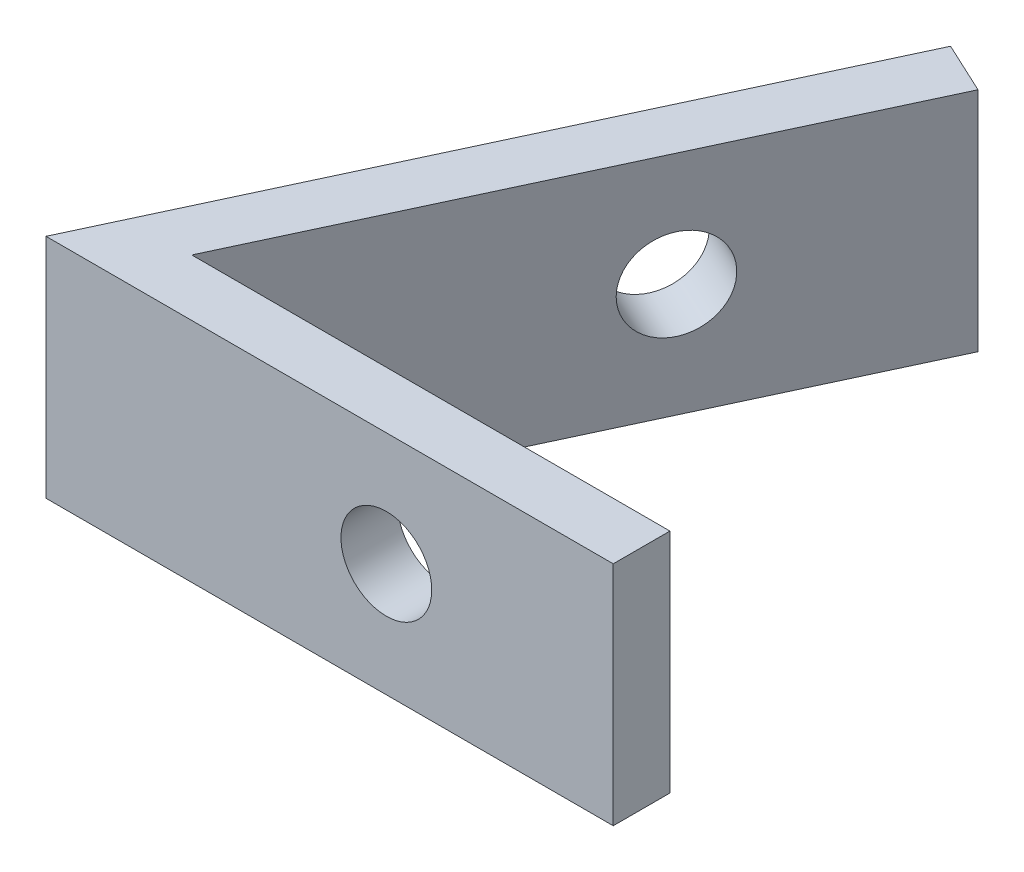
ISO-10303-21;
HEADER;
FILE_DESCRIPTION(('STEP AP214'),'2;1');
FILE_NAME('part.step','',(''),(''),'','','');
FILE_SCHEMA(('AUTOMOTIVE_DESIGN { 1 0 10303 214 1 1 1 1 }'));
ENDSEC;
DATA;
#1=APPLICATION_CONTEXT('core data for automotive mechanical design processes');
#2=APPLICATION_PROTOCOL_DEFINITION('international standard','automotive_design',2000,#1);
#3=PRODUCT_CONTEXT('',#1,'mechanical');
#4=PRODUCT('Part','Part','',(#3));
#5=PRODUCT_RELATED_PRODUCT_CATEGORY('part','',(#4));
#6=PRODUCT_DEFINITION_FORMATION('','',#4);
#7=PRODUCT_DEFINITION_CONTEXT('part definition',#1,'design');
#8=PRODUCT_DEFINITION('design','',#6,#7);
#9=PRODUCT_DEFINITION_SHAPE('','',#8);
#10=(LENGTH_UNIT() NAMED_UNIT(*) SI_UNIT(.MILLI.,.METRE.));
#11=(NAMED_UNIT(*) PLANE_ANGLE_UNIT() SI_UNIT($,.RADIAN.));
#12=(NAMED_UNIT(*) SI_UNIT($,.STERADIAN.) SOLID_ANGLE_UNIT());
#13=UNCERTAINTY_MEASURE_WITH_UNIT(LENGTH_MEASURE(1.E-05),#10,'distance_accuracy_value','');
#14=(GEOMETRIC_REPRESENTATION_CONTEXT(3) GLOBAL_UNCERTAINTY_ASSIGNED_CONTEXT((#13)) GLOBAL_UNIT_ASSIGNED_CONTEXT((#10,
#11,#12)) REPRESENTATION_CONTEXT('',''));
#15=CARTESIAN_POINT('',(0.,0.,0.));
#16=DIRECTION('',(0.,0.,1.));
#17=DIRECTION('',(1.,0.,0.));
#18=AXIS2_PLACEMENT_3D('',#15,#16,#17);
#19=CARTESIAN_POINT('',(0.,20.,0.));
#20=DIRECTION('',(0.,0.,-1.));
#21=DIRECTION('',(-1.,0.,0.));
#22=AXIS2_PLACEMENT_3D('',#19,#20,#21);
#23=PLANE('',#22);
#24=CARTESIAN_POINT('',(-7.32032299515216,10.,0.));
#25=DIRECTION('',(0.,0.,1.));
#26=DIRECTION('',(1.,0.,0.));
#27=AXIS2_PLACEMENT_3D('',#24,#25,#26);
#28=CIRCLE('',#27,4.);
#29=CARTESIAN_POINT('',(-3.32032299515216,10.,0.));
#30=VERTEX_POINT('',#29);
#31=EDGE_CURVE('E157',#30,#30,#28,.T.);
#32=ORIENTED_EDGE('',*,*,#31,.F.);
#33=EDGE_LOOP('',(#32));
#34=FACE_BOUND('',#33,.T.);
#35=DIRECTION('',(1.,0.,0.));
#36=VECTOR('',#35,1.);
#37=CARTESIAN_POINT('',(0.,0.,0.));
#38=LINE('',#37,#36);
#39=CARTESIAN_POINT('',(-37.3203229951522,0.,0.));
#40=VERTEX_POINT('',#39);
#41=CARTESIAN_POINT('',(12.6796770048478,0.,0.));
#42=VERTEX_POINT('',#41);
#43=EDGE_CURVE('E83',#40,#42,#38,.T.);
#44=ORIENTED_EDGE('',*,*,#43,.T.);
#45=DIRECTION('',(0.,-1.,0.));
#46=VECTOR('',#45,1.);
#47=CARTESIAN_POINT('',(12.6796770048478,20.,0.));
#48=LINE('',#47,#46);
#49=CARTESIAN_POINT('',(12.6796770048478,20.,0.));
#50=VERTEX_POINT('',#49);
#51=EDGE_CURVE('E11',#50,#42,#48,.T.);
#52=ORIENTED_EDGE('',*,*,#51,.F.);
#53=DIRECTION('',(1.,0.,0.));
#54=VECTOR('',#53,1.);
#55=CARTESIAN_POINT('',(-37.3203229951522,20.,0.));
#56=LINE('',#55,#54);
#57=CARTESIAN_POINT('',(-37.3203229951522,20.,0.));
#58=VERTEX_POINT('',#57);
#59=EDGE_CURVE('E89',#58,#50,#56,.T.);
#60=ORIENTED_EDGE('',*,*,#59,.F.);
#61=DIRECTION('',(0.,-1.,0.));
#62=VECTOR('',#61,1.);
#63=CARTESIAN_POINT('',(-37.3203229951522,20.,0.));
#64=LINE('',#63,#62);
#65=EDGE_CURVE('E117',#58,#40,#64,.T.);
#66=ORIENTED_EDGE('',*,*,#65,.T.);
#67=EDGE_LOOP('',(#44,#52,#60,#66));
#68=FACE_BOUND('',#67,.T.);
#69=ADVANCED_FACE('F37',(#34,#68),#23,.F.);
#70=CARTESIAN_POINT('',(12.6796770048478,20.,0.));
#71=DIRECTION('',(-1.,0.,0.));
#72=DIRECTION('',(0.,0.,1.));
#73=AXIS2_PLACEMENT_3D('',#70,#71,#72);
#74=PLANE('',#73);
#75=DIRECTION('',(0.,0.,-1.));
#76=VECTOR('',#75,1.);
#77=CARTESIAN_POINT('',(12.6796770048478,0.,0.));
#78=LINE('',#77,#76);
#79=CARTESIAN_POINT('',(12.6796770048478,0.,-5.));
#80=VERTEX_POINT('',#79);
#81=EDGE_CURVE('E122',#42,#80,#78,.T.);
#82=ORIENTED_EDGE('',*,*,#81,.T.);
#83=DIRECTION('',(0.,-1.,0.));
#84=VECTOR('',#83,1.);
#85=CARTESIAN_POINT('',(12.6796770048478,20.,-5.));
#86=LINE('',#85,#84);
#87=CARTESIAN_POINT('',(12.6796770048478,20.,-5.));
#88=VERTEX_POINT('',#87);
#89=EDGE_CURVE('E45',#88,#80,#86,.T.);
#90=ORIENTED_EDGE('',*,*,#89,.F.);
#91=DIRECTION('',(0.,0.,-1.));
#92=VECTOR('',#91,1.);
#93=CARTESIAN_POINT('',(12.6796770048478,20.,0.));
#94=LINE('',#93,#92);
#95=EDGE_CURVE('E145',#50,#88,#94,.T.);
#96=ORIENTED_EDGE('',*,*,#95,.F.);
#97=ORIENTED_EDGE('',*,*,#51,.T.);
#98=EDGE_LOOP('',(#82,#90,#96,#97));
#99=FACE_BOUND('',#98,.T.);
#100=ADVANCED_FACE('F164',(#99),#74,.F.);
#101=CARTESIAN_POINT('',(12.6796770048478,20.,-5.));
#102=DIRECTION('',(0.,0.,1.));
#103=DIRECTION('',(1.,0.,0.));
#104=AXIS2_PLACEMENT_3D('',#101,#102,#103);
#105=PLANE('',#104);
#106=CARTESIAN_POINT('',(-7.32032299515216,10.,-5.));
#107=DIRECTION('',(0.,0.,1.));
#108=DIRECTION('',(1.,0.,0.));
#109=AXIS2_PLACEMENT_3D('',#106,#107,#108);
#110=CIRCLE('',#109,4.);
#111=CARTESIAN_POINT('',(-3.32032299515216,10.,-5.));
#112=VERTEX_POINT('',#111);
#113=EDGE_CURVE('E154',#112,#112,#110,.F.);
#114=ORIENTED_EDGE('',*,*,#113,.F.);
#115=EDGE_LOOP('',(#114));
#116=FACE_BOUND('',#115,.T.);
#117=DIRECTION('',(-1.,0.,0.));
#118=VECTOR('',#117,1.);
#119=CARTESIAN_POINT('',(12.6796770048478,0.,-5.));
#120=LINE('',#119,#118);
#121=CARTESIAN_POINT('',(-29.4718951095647,0.,-4.99999999999999));
#122=VERTEX_POINT('',#121);
#123=EDGE_CURVE('E125',#80,#122,#120,.T.);
#124=ORIENTED_EDGE('',*,*,#123,.T.);
#125=DIRECTION('',(0.,-1.,0.));
#126=VECTOR('',#125,1.);
#127=CARTESIAN_POINT('',(-29.4718951095647,20.,-4.99999999999999));
#128=LINE('',#127,#126);
#129=CARTESIAN_POINT('',(-29.4718951095647,20.,-4.99999999999999));
#130=VERTEX_POINT('',#129);
#131=EDGE_CURVE('E112',#130,#122,#128,.T.);
#132=ORIENTED_EDGE('',*,*,#131,.F.);
#133=DIRECTION('',(-1.,0.,0.));
#134=VECTOR('',#133,1.);
#135=CARTESIAN_POINT('',(12.6796770048478,20.,-5.));
#136=LINE('',#135,#134);
#137=EDGE_CURVE('E103',#88,#130,#136,.T.);
#138=ORIENTED_EDGE('',*,*,#137,.F.);
#139=ORIENTED_EDGE('',*,*,#89,.T.);
#140=EDGE_LOOP('',(#124,#132,#138,#139));
#141=FACE_BOUND('',#140,.T.);
#142=ADVANCED_FACE('F138',(#116,#141),#105,.F.);
#143=CARTESIAN_POINT('',(-29.4718951095647,20.,-4.99999999999999));
#144=DIRECTION('',(-0.906307787036648,0.,-0.422618261740704));
#145=DIRECTION('',(-0.422618261740704,0.,0.906307787036648));
#146=AXIS2_PLACEMENT_3D('',#143,#144,#145);
#147=PLANE('',#146);
#148=CARTESIAN_POINT('',(-15.8840535903408,10.,-34.1392201727624));
#149=DIRECTION('',(-0.906307787036648,0.,-0.422618261740704));
#150=DIRECTION('',(-0.422618261740704,0.,0.906307787036648));
#151=AXIS2_PLACEMENT_3D('',#148,#149,#150);
#152=CIRCLE('',#151,4.);
#153=CARTESIAN_POINT('',(-17.5745266373036,10.,-30.5139890246158));
#154=VERTEX_POINT('',#153);
#155=EDGE_CURVE('E123',#154,#154,#152,.F.);
#156=ORIENTED_EDGE('',*,*,#155,.F.);
#157=EDGE_LOOP('',(#156));
#158=FACE_BOUND('',#157,.T.);
#159=DIRECTION('',(0.422618261740704,0.,-0.906307787036648));
#160=VECTOR('',#159,1.);
#161=CARTESIAN_POINT('',(-29.4718951095647,0.,-4.99999999999999));
#162=LINE('',#161,#160);
#163=CARTESIAN_POINT('',(-7.43168835552671,0.,-52.2653759134954));
#164=VERTEX_POINT('',#163);
#165=EDGE_CURVE('E111',#122,#164,#162,.T.);
#166=ORIENTED_EDGE('',*,*,#165,.T.);
#167=DIRECTION('',(0.,-1.,0.));
#168=VECTOR('',#167,1.);
#169=CARTESIAN_POINT('',(-7.43168835552671,20.,-52.2653759134954));
#170=LINE('',#169,#168);
#171=CARTESIAN_POINT('',(-7.43168835552671,20.,-52.2653759134954));
#172=VERTEX_POINT('',#171);
#173=EDGE_CURVE('E108',#172,#164,#170,.T.);
#174=ORIENTED_EDGE('',*,*,#173,.F.);
#175=DIRECTION('',(0.422618261740704,0.,-0.906307787036648));
#176=VECTOR('',#175,1.);
#177=CARTESIAN_POINT('',(-29.4718951095647,20.,-4.99999999999999));
#178=LINE('',#177,#176);
#179=EDGE_CURVE('E97',#130,#172,#178,.T.);
#180=ORIENTED_EDGE('',*,*,#179,.F.);
#181=ORIENTED_EDGE('',*,*,#131,.T.);
#182=EDGE_LOOP('',(#166,#174,#180,#181));
#183=FACE_BOUND('',#182,.T.);
#184=ADVANCED_FACE('F109',(#158,#183),#147,.F.);
#185=CARTESIAN_POINT('',(-7.43168835552671,20.,-52.2653759134954));
#186=DIRECTION('',(-0.422618261740702,0.,0.906307787036649));
#187=DIRECTION('',(0.906307787036649,0.,0.422618261740702));
#188=AXIS2_PLACEMENT_3D('',#185,#186,#187);
#189=PLANE('',#188);
#190=DIRECTION('',(-0.906307787036649,0.,-0.422618261740702));
#191=VECTOR('',#190,1.);
#192=CARTESIAN_POINT('',(-7.43168835552671,0.,-52.2653759134954));
#193=LINE('',#192,#191);
#194=CARTESIAN_POINT('',(-11.96322729071,0.,-54.3784672221989));
#195=VERTEX_POINT('',#194);
#196=EDGE_CURVE('E76',#164,#195,#193,.T.);
#197=ORIENTED_EDGE('',*,*,#196,.T.);
#198=DIRECTION('',(0.,-1.,0.));
#199=VECTOR('',#198,1.);
#200=CARTESIAN_POINT('',(-11.96322729071,20.,-54.3784672221989));
#201=LINE('',#200,#199);
#202=CARTESIAN_POINT('',(-11.96322729071,20.,-54.3784672221989));
#203=VERTEX_POINT('',#202);
#204=EDGE_CURVE('E113',#203,#195,#201,.T.);
#205=ORIENTED_EDGE('',*,*,#204,.F.);
#206=DIRECTION('',(-0.906307787036649,0.,-0.422618261740702));
#207=VECTOR('',#206,1.);
#208=CARTESIAN_POINT('',(-7.43168835552671,20.,-52.2653759134954));
#209=LINE('',#208,#207);
#210=EDGE_CURVE('E101',#172,#203,#209,.T.);
#211=ORIENTED_EDGE('',*,*,#210,.F.);
#212=ORIENTED_EDGE('',*,*,#173,.T.);
#213=EDGE_LOOP('',(#197,#205,#211,#212));
#214=FACE_BOUND('',#213,.T.);
#215=ADVANCED_FACE('F115',(#214),#189,.F.);
#216=CARTESIAN_POINT('',(-11.96322729071,20.,-54.3784672221989));
#217=DIRECTION('',(0.906307787036648,0.,0.422618261740703));
#218=DIRECTION('',(0.422618261740703,0.,-0.906307787036648));
#219=AXIS2_PLACEMENT_3D('',#216,#217,#218);
#220=PLANE('',#219);
#221=CARTESIAN_POINT('',(-20.415592525524,10.,-36.2523114814659));
#222=DIRECTION('',(-0.906307787036648,0.,-0.422618261740704));
#223=DIRECTION('',(-0.422618261740704,0.,0.906307787036648));
#224=AXIS2_PLACEMENT_3D('',#221,#222,#223);
#225=CIRCLE('',#224,4.);
#226=CARTESIAN_POINT('',(-22.1060655724869,10.,-32.6270803333193));
#227=VERTEX_POINT('',#226);
#228=EDGE_CURVE('E151',#227,#227,#225,.T.);
#229=ORIENTED_EDGE('',*,*,#228,.F.);
#230=EDGE_LOOP('',(#229));
#231=FACE_BOUND('',#230,.T.);
#232=DIRECTION('',(-0.422618261740703,0.,0.906307787036648));
#233=VECTOR('',#232,1.);
#234=CARTESIAN_POINT('',(-11.96322729071,0.,-54.3784672221989));
#235=LINE('',#234,#233);
#236=EDGE_CURVE('E129',#195,#40,#235,.T.);
#237=ORIENTED_EDGE('',*,*,#236,.T.);
#238=ORIENTED_EDGE('',*,*,#65,.F.);
#239=DIRECTION('',(-0.422618261740703,0.,0.906307787036648));
#240=VECTOR('',#239,1.);
#241=CARTESIAN_POINT('',(-11.96322729071,20.,-54.3784672221989));
#242=LINE('',#241,#240);
#243=EDGE_CURVE('E53',#203,#58,#242,.T.);
#244=ORIENTED_EDGE('',*,*,#243,.F.);
#245=ORIENTED_EDGE('',*,*,#204,.T.);
#246=EDGE_LOOP('',(#237,#238,#244,#245));
#247=FACE_BOUND('',#246,.T.);
#248=ADVANCED_FACE('F143',(#231,#247),#220,.F.);
#249=CARTESIAN_POINT('',(0.,20.,0.));
#250=DIRECTION('',(0.,1.,0.));
#251=DIRECTION('',(0.,0.,1.));
#252=AXIS2_PLACEMENT_3D('',#249,#250,#251);
#253=PLANE('',#252);
#254=ORIENTED_EDGE('',*,*,#59,.T.);
#255=ORIENTED_EDGE('',*,*,#95,.T.);
#256=ORIENTED_EDGE('',*,*,#137,.T.);
#257=ORIENTED_EDGE('',*,*,#179,.T.);
#258=ORIENTED_EDGE('',*,*,#210,.T.);
#259=ORIENTED_EDGE('',*,*,#243,.T.);
#260=EDGE_LOOP('',(#254,#255,#256,#257,#258,#259));
#261=FACE_BOUND('',#260,.T.);
#262=ADVANCED_FACE('F99',(#261),#253,.T.);
#263=CARTESIAN_POINT('',(0.,0.,0.));
#264=DIRECTION('',(0.,1.,0.));
#265=DIRECTION('',(0.,0.,1.));
#266=AXIS2_PLACEMENT_3D('',#263,#264,#265);
#267=PLANE('',#266);
#268=ORIENTED_EDGE('',*,*,#43,.F.);
#269=ORIENTED_EDGE('',*,*,#236,.F.);
#270=ORIENTED_EDGE('',*,*,#196,.F.);
#271=ORIENTED_EDGE('',*,*,#165,.F.);
#272=ORIENTED_EDGE('',*,*,#123,.F.);
#273=ORIENTED_EDGE('',*,*,#81,.F.);
#274=EDGE_LOOP('',(#268,#269,#270,#271,#272,#273));
#275=FACE_BOUND('',#274,.T.);
#276=ADVANCED_FACE('F141',(#275),#267,.F.);
#277=CARTESIAN_POINT('',(-5.6303514774482,10.,-29.3578403530804));
#278=DIRECTION('',(-0.906307787036648,0.,-0.422618261740704));
#279=DIRECTION('',(-0.422618261740704,0.,0.906307787036648));
#280=AXIS2_PLACEMENT_3D('',#277,#278,#279);
#281=CYLINDRICAL_SURFACE('',#280,4.);
#282=ORIENTED_EDGE('',*,*,#155,.T.);
#283=EDGE_LOOP('',(#282));
#284=FACE_BOUND('',#283,.T.);
#285=ORIENTED_EDGE('',*,*,#228,.T.);
#286=EDGE_LOOP('',(#285));
#287=FACE_BOUND('',#286,.T.);
#288=ADVANCED_FACE('F184',(#284,#287),#281,.F.);
#289=CARTESIAN_POINT('',(-7.32032299515216,10.,-16.3137084989848));
#290=DIRECTION('',(0.,0.,1.));
#291=DIRECTION('',(1.,0.,0.));
#292=AXIS2_PLACEMENT_3D('',#289,#290,#291);
#293=CYLINDRICAL_SURFACE('',#292,4.);
#294=ORIENTED_EDGE('',*,*,#113,.T.);
#295=EDGE_LOOP('',(#294));
#296=FACE_BOUND('',#295,.T.);
#297=ORIENTED_EDGE('',*,*,#31,.T.);
#298=EDGE_LOOP('',(#297));
#299=FACE_BOUND('',#298,.T.);
#300=ADVANCED_FACE('F161',(#296,#299),#293,.F.);
#301=CLOSED_SHELL('',(#69,#100,#142,#184,#215,#248,#262,#276,#288,#300));
#302=MANIFOLD_SOLID_BREP('B2',#301);
#303=ADVANCED_BREP_SHAPE_REPRESENTATION('',(#18,#302),#14);
#304=SHAPE_DEFINITION_REPRESENTATION(#9,#303);
ENDSEC;
END-ISO-10303-21;
